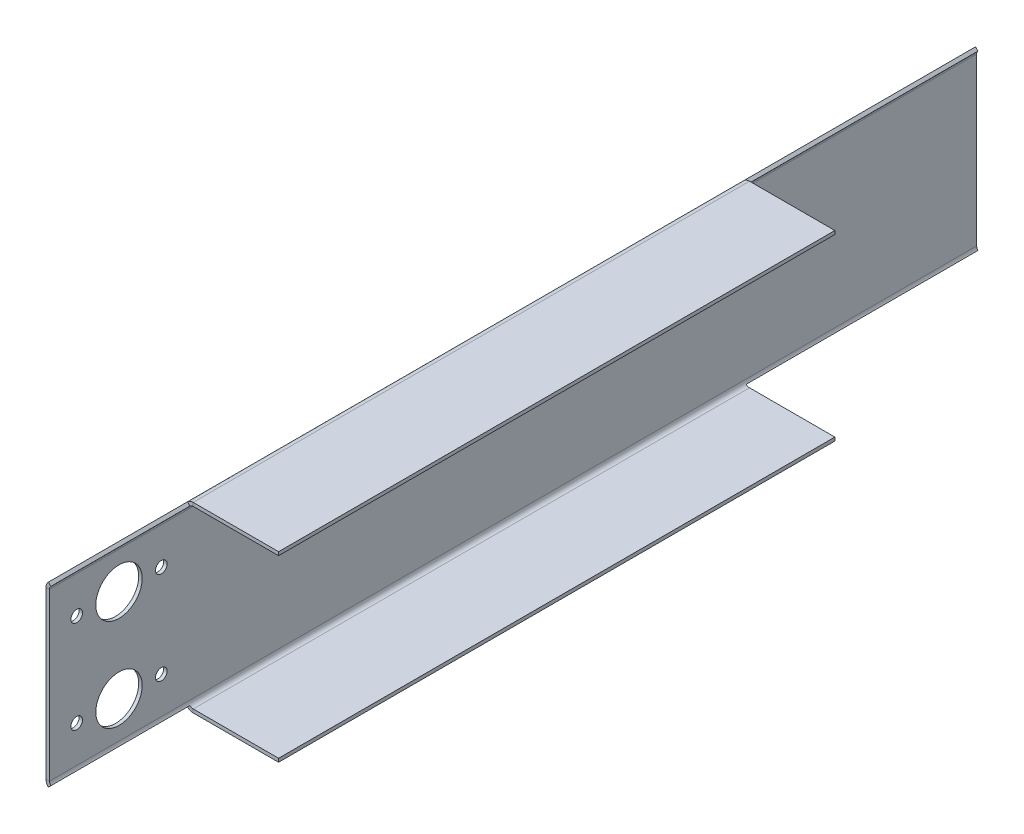
ISO-10303-21;
HEADER;
FILE_DESCRIPTION(('STEP AP214'),'2;1');
FILE_NAME('part.step','',(''),(''),'','','');
FILE_SCHEMA(('AUTOMOTIVE_DESIGN { 1 0 10303 214 1 1 1 1 }'));
ENDSEC;
DATA;
#1=APPLICATION_CONTEXT('core data for automotive mechanical design processes');
#2=APPLICATION_PROTOCOL_DEFINITION('international standard','automotive_design',2000,#1);
#3=PRODUCT_CONTEXT('',#1,'mechanical');
#4=PRODUCT('Part','Part','',(#3));
#5=PRODUCT_RELATED_PRODUCT_CATEGORY('part','',(#4));
#6=PRODUCT_DEFINITION_FORMATION('','',#4);
#7=PRODUCT_DEFINITION_CONTEXT('part definition',#1,'design');
#8=PRODUCT_DEFINITION('design','',#6,#7);
#9=PRODUCT_DEFINITION_SHAPE('','',#8);
#10=(LENGTH_UNIT() NAMED_UNIT(*) SI_UNIT(.MILLI.,.METRE.));
#11=(NAMED_UNIT(*) PLANE_ANGLE_UNIT() SI_UNIT($,.RADIAN.));
#12=(NAMED_UNIT(*) SI_UNIT($,.STERADIAN.) SOLID_ANGLE_UNIT());
#13=UNCERTAINTY_MEASURE_WITH_UNIT(LENGTH_MEASURE(1.E-05),#10,'distance_accuracy_value','');
#14=(GEOMETRIC_REPRESENTATION_CONTEXT(3) GLOBAL_UNCERTAINTY_ASSIGNED_CONTEXT((#13)) GLOBAL_UNIT_ASSIGNED_CONTEXT((#10,
#11,#12)) REPRESENTATION_CONTEXT('',''));
#15=CARTESIAN_POINT('',(0.,0.,0.));
#16=DIRECTION('',(0.,0.,1.));
#17=DIRECTION('',(1.,0.,0.));
#18=AXIS2_PLACEMENT_3D('',#15,#16,#17);
#19=CARTESIAN_POINT('',(0.,0.,-400.));
#20=DIRECTION('',(0.,0.,1.));
#21=DIRECTION('',(0.,1.,0.));
#22=AXIS2_PLACEMENT_3D('',#19,#20,#21);
#23=PLANE('',#22);
#24=DIRECTION('',(0.,1.,0.));
#25=VECTOR('',#24,1.);
#26=CARTESIAN_POINT('',(0.,0.,-400.));
#27=LINE('',#26,#25);
#28=CARTESIAN_POINT('',(0.,41.159844949343,-400.));
#29=VERTEX_POINT('',#28);
#30=CARTESIAN_POINT('',(0.,112.840155050657,-400.));
#31=VERTEX_POINT('',#30);
#32=EDGE_CURVE('E308',#29,#31,#27,.T.);
#33=ORIENTED_EDGE('',*,*,#32,.T.);
#34=DIRECTION('',(1.,0.,0.));
#35=VECTOR('',#34,1.);
#36=CARTESIAN_POINT('',(0.,112.840155050657,-400.));
#37=LINE('',#36,#35);
#38=CARTESIAN_POINT('',(1.5,112.840155050657,-400.));
#39=VERTEX_POINT('',#38);
#40=EDGE_CURVE('E12',#31,#39,#37,.T.);
#41=ORIENTED_EDGE('',*,*,#40,.T.);
#42=DIRECTION('',(0.,1.,0.));
#43=VECTOR('',#42,1.);
#44=CARTESIAN_POINT('',(1.5,0.,-400.));
#45=LINE('',#44,#43);
#46=CARTESIAN_POINT('',(1.5,41.159844949343,-400.));
#47=VERTEX_POINT('',#46);
#48=EDGE_CURVE('E312',#47,#39,#45,.T.);
#49=ORIENTED_EDGE('',*,*,#48,.F.);
#50=DIRECTION('',(-1.,0.,0.));
#51=VECTOR('',#50,1.);
#52=CARTESIAN_POINT('',(0.,41.159844949343,-400.));
#53=LINE('',#52,#51);
#54=EDGE_CURVE('E305',#47,#29,#53,.T.);
#55=ORIENTED_EDGE('',*,*,#54,.T.);
#56=EDGE_LOOP('',(#33,#41,#49,#55));
#57=FACE_BOUND('',#56,.T.);
#58=ADVANCED_FACE('F44',(#57),#23,.F.);
#59=CARTESIAN_POINT('',(0.,0.,0.));
#60=DIRECTION('',(0.,0.,-1.));
#61=DIRECTION('',(0.,-1.,0.));
#62=AXIS2_PLACEMENT_3D('',#59,#60,#61);
#63=PLANE('',#62);
#64=DIRECTION('',(0.,1.,0.));
#65=VECTOR('',#64,1.);
#66=CARTESIAN_POINT('',(1.5,0.,0.));
#67=LINE('',#66,#65);
#68=CARTESIAN_POINT('',(1.5,112.840155050657,0.));
#69=VERTEX_POINT('',#68);
#70=CARTESIAN_POINT('',(1.5,41.159844949343,0.));
#71=VERTEX_POINT('',#70);
#72=EDGE_CURVE('E48',#69,#71,#67,.F.);
#73=ORIENTED_EDGE('',*,*,#72,.F.);
#74=DIRECTION('',(-1.,0.,0.));
#75=VECTOR('',#74,1.);
#76=CARTESIAN_POINT('',(0.,112.840155050657,0.));
#77=LINE('',#76,#75);
#78=CARTESIAN_POINT('',(0.,112.840155050657,0.));
#79=VERTEX_POINT('',#78);
#80=EDGE_CURVE('E387',#69,#79,#77,.T.);
#81=ORIENTED_EDGE('',*,*,#80,.T.);
#82=DIRECTION('',(0.,-1.,0.));
#83=VECTOR('',#82,1.);
#84=CARTESIAN_POINT('',(0.,0.,0.));
#85=LINE('',#84,#83);
#86=CARTESIAN_POINT('',(0.,41.1598449493429,0.));
#87=VERTEX_POINT('',#86);
#88=EDGE_CURVE('E313',#79,#87,#85,.T.);
#89=ORIENTED_EDGE('',*,*,#88,.T.);
#90=DIRECTION('',(1.,0.,0.));
#91=VECTOR('',#90,1.);
#92=CARTESIAN_POINT('',(0.,41.1598449493429,0.));
#93=LINE('',#92,#91);
#94=EDGE_CURVE('E309',#87,#71,#93,.T.);
#95=ORIENTED_EDGE('',*,*,#94,.T.);
#96=EDGE_LOOP('',(#73,#81,#89,#95));
#97=FACE_BOUND('',#96,.T.);
#98=ADVANCED_FACE('F411',(#97),#63,.F.);
#99=CARTESIAN_POINT('',(0.,0.,0.));
#100=DIRECTION('',(-1.,0.,0.));
#101=DIRECTION('',(0.,0.,1.));
#102=AXIS2_PLACEMENT_3D('',#99,#100,#101);
#103=PLANE('',#102);
#104=CARTESIAN_POINT('',(0.,96.9999999999999,-11.75));
#105=DIRECTION('',(1.,0.,0.));
#106=DIRECTION('',(0.,0.,1.));
#107=AXIS2_PLACEMENT_3D('',#104,#105,#106);
#108=CIRCLE('',#107,2.5);
#109=CARTESIAN_POINT('',(0.,96.9999999999999,-9.24999999999999));
#110=VERTEX_POINT('',#109);
#111=EDGE_CURVE('E332',#110,#110,#108,.T.);
#112=ORIENTED_EDGE('',*,*,#111,.T.);
#113=EDGE_LOOP('',(#112));
#114=FACE_BOUND('',#113,.T.);
#115=CARTESIAN_POINT('',(0.,96.9999999999999,-48.25));
#116=DIRECTION('',(1.,0.,0.));
#117=DIRECTION('',(0.,0.,1.));
#118=AXIS2_PLACEMENT_3D('',#115,#116,#117);
#119=CIRCLE('',#118,2.5);
#120=CARTESIAN_POINT('',(0.,96.9999999999999,-45.75));
#121=VERTEX_POINT('',#120);
#122=EDGE_CURVE('E329',#121,#121,#119,.T.);
#123=ORIENTED_EDGE('',*,*,#122,.T.);
#124=EDGE_LOOP('',(#123));
#125=FACE_BOUND('',#124,.T.);
#126=CARTESIAN_POINT('',(0.,57.,-48.25));
#127=DIRECTION('',(1.,0.,0.));
#128=DIRECTION('',(0.,0.,-1.));
#129=AXIS2_PLACEMENT_3D('',#126,#127,#128);
#130=CIRCLE('',#129,2.5);
#131=CARTESIAN_POINT('',(0.,57.,-50.75));
#132=VERTEX_POINT('',#131);
#133=EDGE_CURVE('E326',#132,#132,#130,.T.);
#134=ORIENTED_EDGE('',*,*,#133,.T.);
#135=EDGE_LOOP('',(#134));
#136=FACE_BOUND('',#135,.T.);
#137=CARTESIAN_POINT('',(0.,57.,-11.75));
#138=DIRECTION('',(1.,0.,0.));
#139=DIRECTION('',(0.,0.,-1.));
#140=AXIS2_PLACEMENT_3D('',#137,#138,#139);
#141=CIRCLE('',#140,2.5);
#142=CARTESIAN_POINT('',(0.,57.,-14.25));
#143=VERTEX_POINT('',#142);
#144=EDGE_CURVE('E323',#143,#143,#141,.T.);
#145=ORIENTED_EDGE('',*,*,#144,.T.);
#146=EDGE_LOOP('',(#145));
#147=FACE_BOUND('',#146,.T.);
#148=CARTESIAN_POINT('',(0.,96.9999999999999,-30.));
#149=DIRECTION('',(1.,0.,0.));
#150=DIRECTION('',(0.,0.,1.));
#151=AXIS2_PLACEMENT_3D('',#148,#149,#150);
#152=CIRCLE('',#151,9.99999999999999);
#153=CARTESIAN_POINT('',(0.,96.9999999999999,-20.));
#154=VERTEX_POINT('',#153);
#155=EDGE_CURVE('E320',#154,#154,#152,.T.);
#156=ORIENTED_EDGE('',*,*,#155,.T.);
#157=EDGE_LOOP('',(#156));
#158=FACE_BOUND('',#157,.T.);
#159=CARTESIAN_POINT('',(0.,57.,-30.));
#160=DIRECTION('',(1.,0.,0.));
#161=DIRECTION('',(0.,0.,-1.));
#162=AXIS2_PLACEMENT_3D('',#159,#160,#161);
#163=CIRCLE('',#162,10.);
#164=CARTESIAN_POINT('',(0.,57.,-40.));
#165=VERTEX_POINT('',#164);
#166=EDGE_CURVE('E317',#165,#165,#163,.T.);
#167=ORIENTED_EDGE('',*,*,#166,.T.);
#168=EDGE_LOOP('',(#167));
#169=FACE_BOUND('',#168,.T.);
#170=ORIENTED_EDGE('',*,*,#88,.F.);
#171=DIRECTION('',(0.,0.,-1.));
#172=VECTOR('',#171,1.);
#173=CARTESIAN_POINT('',(0.,112.840155050657,0.));
#174=LINE('',#173,#172);
#175=EDGE_CURVE('E378',#79,#31,#174,.T.);
#176=ORIENTED_EDGE('',*,*,#175,.T.);
#177=ORIENTED_EDGE('',*,*,#32,.F.);
#178=DIRECTION('',(0.,0.,1.));
#179=VECTOR('',#178,1.);
#180=CARTESIAN_POINT('',(0.,41.1598449493429,0.));
#181=LINE('',#180,#179);
#182=EDGE_CURVE('E314',#29,#87,#181,.T.);
#183=ORIENTED_EDGE('',*,*,#182,.T.);
#184=EDGE_LOOP('',(#170,#176,#177,#183));
#185=FACE_BOUND('',#184,.T.);
#186=ADVANCED_FACE('F414',(#114,#125,#136,#147,#158,#169,#185),#103,.T.);
#187=CARTESIAN_POINT('',(40.340155050657,39.1598449493431,0.));
#188=DIRECTION('',(0.,-1.,0.));
#189=DIRECTION('',(0.,0.,1.));
#190=AXIS2_PLACEMENT_3D('',#187,#188,#189);
#191=PLANE('',#190);
#192=DIRECTION('',(-1.,0.,0.));
#193=VECTOR('',#192,1.);
#194=CARTESIAN_POINT('',(40.340155050657,39.1598449493431,-300.));
#195=LINE('',#194,#193);
#196=CARTESIAN_POINT('',(40.340155050657,39.1598449493431,-300.));
#197=VERTEX_POINT('',#196);
#198=CARTESIAN_POINT('',(3.50000000000003,39.159844949343,-300.));
#199=VERTEX_POINT('',#198);
#200=EDGE_CURVE('E69',#197,#199,#195,.T.);
#201=ORIENTED_EDGE('',*,*,#200,.T.);
#202=DIRECTION('',(0.,0.,1.));
#203=VECTOR('',#202,1.);
#204=CARTESIAN_POINT('',(3.50000000000002,39.1598449493429,0.));
#205=LINE('',#204,#203);
#206=CARTESIAN_POINT('',(3.5,39.159844949343,-60.));
#207=VERTEX_POINT('',#206);
#208=EDGE_CURVE('E373',#199,#207,#205,.T.);
#209=ORIENTED_EDGE('',*,*,#208,.T.);
#210=DIRECTION('',(-1.,0.,0.));
#211=VECTOR('',#210,1.);
#212=CARTESIAN_POINT('',(40.340155050657,39.1598449493431,-60.));
#213=LINE('',#212,#211);
#214=CARTESIAN_POINT('',(40.340155050657,39.1598449493431,-60.));
#215=VERTEX_POINT('',#214);
#216=EDGE_CURVE('E382',#207,#215,#213,.F.);
#217=ORIENTED_EDGE('',*,*,#216,.T.);
#218=DIRECTION('',(0.,0.,1.));
#219=VECTOR('',#218,1.);
#220=CARTESIAN_POINT('',(40.340155050657,39.1598449493431,0.));
#221=LINE('',#220,#219);
#222=EDGE_CURVE('E360',#215,#197,#221,.F.);
#223=ORIENTED_EDGE('',*,*,#222,.T.);
#224=EDGE_LOOP('',(#201,#209,#217,#223));
#225=FACE_BOUND('',#224,.T.);
#226=ADVANCED_FACE('F457',(#225),#191,.F.);
#227=CARTESIAN_POINT('',(40.340155050657,37.6598449493431,-300.));
#228=DIRECTION('',(0.,0.,1.));
#229=DIRECTION('',(-1.,0.,0.));
#230=AXIS2_PLACEMENT_3D('',#227,#228,#229);
#231=PLANE('',#230);
#232=DIRECTION('',(0.,-1.,0.));
#233=VECTOR('',#232,1.);
#234=CARTESIAN_POINT('',(3.50000000000002,37.659844949343,-300.));
#235=LINE('',#234,#233);
#236=CARTESIAN_POINT('',(3.50000000000004,37.659844949343,-300.));
#237=VERTEX_POINT('',#236);
#238=EDGE_CURVE('E375',#199,#237,#235,.T.);
#239=ORIENTED_EDGE('',*,*,#238,.F.);
#240=ORIENTED_EDGE('',*,*,#200,.F.);
#241=DIRECTION('',(0.,-1.,0.));
#242=VECTOR('',#241,1.);
#243=CARTESIAN_POINT('',(40.340155050657,37.6598449493431,-300.));
#244=LINE('',#243,#242);
#245=CARTESIAN_POINT('',(40.340155050657,37.6598449493431,-300.));
#246=VERTEX_POINT('',#245);
#247=EDGE_CURVE('E365',#197,#246,#244,.T.);
#248=ORIENTED_EDGE('',*,*,#247,.T.);
#249=DIRECTION('',(-1.,0.,0.));
#250=VECTOR('',#249,1.);
#251=CARTESIAN_POINT('',(40.340155050657,37.6598449493431,-300.));
#252=LINE('',#251,#250);
#253=EDGE_CURVE('E359',#246,#237,#252,.T.);
#254=ORIENTED_EDGE('',*,*,#253,.T.);
#255=EDGE_LOOP('',(#239,#240,#248,#254));
#256=FACE_BOUND('',#255,.T.);
#257=ADVANCED_FACE('F462',(#256),#231,.F.);
#258=CARTESIAN_POINT('',(40.340155050657,37.6598449493431,0.));
#259=DIRECTION('',(-1.,0.,0.));
#260=DIRECTION('',(0.,0.,-1.));
#261=AXIS2_PLACEMENT_3D('',#258,#259,#260);
#262=PLANE('',#261);
#263=ORIENTED_EDGE('',*,*,#247,.F.);
#264=ORIENTED_EDGE('',*,*,#222,.F.);
#265=DIRECTION('',(0.,-1.,0.));
#266=VECTOR('',#265,1.);
#267=CARTESIAN_POINT('',(40.340155050657,37.6598449493431,-60.));
#268=LINE('',#267,#266);
#269=CARTESIAN_POINT('',(40.340155050657,37.6598449493431,-60.));
#270=VERTEX_POINT('',#269);
#271=EDGE_CURVE('E358',#215,#270,#268,.T.);
#272=ORIENTED_EDGE('',*,*,#271,.T.);
#273=DIRECTION('',(0.,0.,-1.));
#274=VECTOR('',#273,1.);
#275=CARTESIAN_POINT('',(40.340155050657,37.6598449493431,0.));
#276=LINE('',#275,#274);
#277=EDGE_CURVE('E355',#270,#246,#276,.T.);
#278=ORIENTED_EDGE('',*,*,#277,.T.);
#279=EDGE_LOOP('',(#263,#264,#272,#278));
#280=FACE_BOUND('',#279,.T.);
#281=ADVANCED_FACE('F503',(#280),#262,.F.);
#282=CARTESIAN_POINT('',(40.340155050657,37.6598449493431,-60.));
#283=DIRECTION('',(0.,0.,-1.));
#284=DIRECTION('',(1.,0.,0.));
#285=AXIS2_PLACEMENT_3D('',#282,#283,#284);
#286=PLANE('',#285);
#287=DIRECTION('',(0.,1.,0.));
#288=VECTOR('',#287,1.);
#289=CARTESIAN_POINT('',(3.50000000000002,37.659844949343,-60.));
#290=LINE('',#289,#288);
#291=CARTESIAN_POINT('',(3.49999999999999,37.6598449493429,-59.9999999999999));
#292=VERTEX_POINT('',#291);
#293=EDGE_CURVE('E370',#292,#207,#290,.T.);
#294=ORIENTED_EDGE('',*,*,#293,.F.);
#295=DIRECTION('',(1.,0.,0.));
#296=VECTOR('',#295,1.);
#297=CARTESIAN_POINT('',(40.340155050657,37.6598449493431,-60.));
#298=LINE('',#297,#296);
#299=EDGE_CURVE('E362',#292,#270,#298,.T.);
#300=ORIENTED_EDGE('',*,*,#299,.T.);
#301=ORIENTED_EDGE('',*,*,#271,.F.);
#302=ORIENTED_EDGE('',*,*,#216,.F.);
#303=EDGE_LOOP('',(#294,#300,#301,#302));
#304=FACE_BOUND('',#303,.T.);
#305=ADVANCED_FACE('F506',(#304),#286,.F.);
#306=CARTESIAN_POINT('',(40.340155050657,37.6598449493431,0.));
#307=DIRECTION('',(0.,-1.,0.));
#308=DIRECTION('',(0.,0.,1.));
#309=AXIS2_PLACEMENT_3D('',#306,#307,#308);
#310=PLANE('',#309);
#311=DIRECTION('',(0.,0.,1.));
#312=VECTOR('',#311,1.);
#313=CARTESIAN_POINT('',(3.50000000000002,37.6598449493429,0.));
#314=LINE('',#313,#312);
#315=EDGE_CURVE('E367',#237,#292,#314,.T.);
#316=ORIENTED_EDGE('',*,*,#315,.F.);
#317=ORIENTED_EDGE('',*,*,#253,.F.);
#318=ORIENTED_EDGE('',*,*,#277,.F.);
#319=ORIENTED_EDGE('',*,*,#299,.F.);
#320=EDGE_LOOP('',(#316,#317,#318,#319));
#321=FACE_BOUND('',#320,.T.);
#322=ADVANCED_FACE('F480',(#321),#310,.T.);
#323=CARTESIAN_POINT('',(0.,57.,-30.));
#324=DIRECTION('',(1.,0.,0.));
#325=DIRECTION('',(0.,0.,-1.));
#326=AXIS2_PLACEMENT_3D('',#323,#324,#325);
#327=CYLINDRICAL_SURFACE('',#326,10.);
#328=ORIENTED_EDGE('',*,*,#166,.F.);
#329=EDGE_LOOP('',(#328));
#330=FACE_BOUND('',#329,.T.);
#331=CARTESIAN_POINT('',(1.5,57.,-30.));
#332=DIRECTION('',(1.,0.,0.));
#333=DIRECTION('',(0.,0.,-1.));
#334=AXIS2_PLACEMENT_3D('',#331,#332,#333);
#335=CIRCLE('',#334,10.);
#336=CARTESIAN_POINT('',(1.5,57.,-40.));
#337=VERTEX_POINT('',#336);
#338=EDGE_CURVE('E350',#337,#337,#335,.T.);
#339=ORIENTED_EDGE('',*,*,#338,.T.);
#340=EDGE_LOOP('',(#339));
#341=FACE_BOUND('',#340,.T.);
#342=ADVANCED_FACE('F476',(#330,#341),#327,.F.);
#343=CARTESIAN_POINT('',(0.,96.9999999999999,-30.));
#344=DIRECTION('',(1.,0.,0.));
#345=DIRECTION('',(0.,0.,-1.));
#346=AXIS2_PLACEMENT_3D('',#343,#344,#345);
#347=CYLINDRICAL_SURFACE('',#346,9.99999999999999);
#348=ORIENTED_EDGE('',*,*,#155,.F.);
#349=EDGE_LOOP('',(#348));
#350=FACE_BOUND('',#349,.T.);
#351=CARTESIAN_POINT('',(1.5,96.9999999999999,-30.));
#352=DIRECTION('',(1.,0.,0.));
#353=DIRECTION('',(0.,0.,-1.));
#354=AXIS2_PLACEMENT_3D('',#351,#352,#353);
#355=CIRCLE('',#354,9.99999999999999);
#356=CARTESIAN_POINT('',(1.5,96.9999999999999,-40.));
#357=VERTEX_POINT('',#356);
#358=EDGE_CURVE('E347',#357,#357,#355,.T.);
#359=ORIENTED_EDGE('',*,*,#358,.T.);
#360=EDGE_LOOP('',(#359));
#361=FACE_BOUND('',#360,.T.);
#362=ADVANCED_FACE('F479',(#350,#361),#347,.F.);
#363=CARTESIAN_POINT('',(0.,57.,-11.75));
#364=DIRECTION('',(1.,0.,0.));
#365=DIRECTION('',(0.,0.,-1.));
#366=AXIS2_PLACEMENT_3D('',#363,#364,#365);
#367=CYLINDRICAL_SURFACE('',#366,2.5);
#368=ORIENTED_EDGE('',*,*,#144,.F.);
#369=EDGE_LOOP('',(#368));
#370=FACE_BOUND('',#369,.T.);
#371=CARTESIAN_POINT('',(1.5,57.,-11.75));
#372=DIRECTION('',(1.,0.,0.));
#373=DIRECTION('',(0.,0.,-1.));
#374=AXIS2_PLACEMENT_3D('',#371,#372,#373);
#375=CIRCLE('',#374,2.5);
#376=CARTESIAN_POINT('',(1.5,57.,-14.25));
#377=VERTEX_POINT('',#376);
#378=EDGE_CURVE('E344',#377,#377,#375,.T.);
#379=ORIENTED_EDGE('',*,*,#378,.T.);
#380=EDGE_LOOP('',(#379));
#381=FACE_BOUND('',#380,.T.);
#382=ADVANCED_FACE('F543',(#370,#381),#367,.F.);
#383=CARTESIAN_POINT('',(0.,57.,-48.25));
#384=DIRECTION('',(1.,0.,0.));
#385=DIRECTION('',(0.,0.,-1.));
#386=AXIS2_PLACEMENT_3D('',#383,#384,#385);
#387=CYLINDRICAL_SURFACE('',#386,2.5);
#388=ORIENTED_EDGE('',*,*,#133,.F.);
#389=EDGE_LOOP('',(#388));
#390=FACE_BOUND('',#389,.T.);
#391=CARTESIAN_POINT('',(1.5,57.,-48.25));
#392=DIRECTION('',(1.,0.,0.));
#393=DIRECTION('',(0.,0.,-1.));
#394=AXIS2_PLACEMENT_3D('',#391,#392,#393);
#395=CIRCLE('',#394,2.5);
#396=CARTESIAN_POINT('',(1.5,57.,-50.75));
#397=VERTEX_POINT('',#396);
#398=EDGE_CURVE('E341',#397,#397,#395,.T.);
#399=ORIENTED_EDGE('',*,*,#398,.T.);
#400=EDGE_LOOP('',(#399));
#401=FACE_BOUND('',#400,.T.);
#402=ADVANCED_FACE('F497',(#390,#401),#387,.F.);
#403=CARTESIAN_POINT('',(0.,96.9999999999999,-48.25));
#404=DIRECTION('',(1.,0.,0.));
#405=DIRECTION('',(0.,0.,-1.));
#406=AXIS2_PLACEMENT_3D('',#403,#404,#405);
#407=CYLINDRICAL_SURFACE('',#406,2.5);
#408=ORIENTED_EDGE('',*,*,#122,.F.);
#409=EDGE_LOOP('',(#408));
#410=FACE_BOUND('',#409,.T.);
#411=CARTESIAN_POINT('',(1.5,96.9999999999999,-48.25));
#412=DIRECTION('',(1.,0.,0.));
#413=DIRECTION('',(0.,0.,-1.));
#414=AXIS2_PLACEMENT_3D('',#411,#412,#413);
#415=CIRCLE('',#414,2.5);
#416=CARTESIAN_POINT('',(1.5,96.9999999999999,-50.75));
#417=VERTEX_POINT('',#416);
#418=EDGE_CURVE('E338',#417,#417,#415,.T.);
#419=ORIENTED_EDGE('',*,*,#418,.T.);
#420=EDGE_LOOP('',(#419));
#421=FACE_BOUND('',#420,.T.);
#422=ADVANCED_FACE('F491',(#410,#421),#407,.F.);
#423=CARTESIAN_POINT('',(0.,96.9999999999999,-11.75));
#424=DIRECTION('',(1.,0.,0.));
#425=DIRECTION('',(0.,0.,-1.));
#426=AXIS2_PLACEMENT_3D('',#423,#424,#425);
#427=CYLINDRICAL_SURFACE('',#426,2.5);
#428=ORIENTED_EDGE('',*,*,#111,.F.);
#429=EDGE_LOOP('',(#428));
#430=FACE_BOUND('',#429,.T.);
#431=CARTESIAN_POINT('',(1.5,96.9999999999999,-11.75));
#432=DIRECTION('',(1.,0.,0.));
#433=DIRECTION('',(0.,0.,-1.));
#434=AXIS2_PLACEMENT_3D('',#431,#432,#433);
#435=CIRCLE('',#434,2.5);
#436=CARTESIAN_POINT('',(1.5,96.9999999999999,-14.25));
#437=VERTEX_POINT('',#436);
#438=EDGE_CURVE('E335',#437,#437,#435,.T.);
#439=ORIENTED_EDGE('',*,*,#438,.T.);
#440=EDGE_LOOP('',(#439));
#441=FACE_BOUND('',#440,.T.);
#442=ADVANCED_FACE('F485',(#430,#441),#427,.F.);
#443=CARTESIAN_POINT('',(1.5,0.,0.));
#444=DIRECTION('',(-1.,0.,0.));
#445=DIRECTION('',(0.,0.,1.));
#446=AXIS2_PLACEMENT_3D('',#443,#444,#445);
#447=PLANE('',#446);
#448=DIRECTION('',(0.,0.,-1.));
#449=VECTOR('',#448,1.);
#450=CARTESIAN_POINT('',(1.5,112.840155050657,0.));
#451=LINE('',#450,#449);
#452=EDGE_CURVE('E53',#69,#39,#451,.T.);
#453=ORIENTED_EDGE('',*,*,#452,.F.);
#454=ORIENTED_EDGE('',*,*,#72,.T.);
#455=DIRECTION('',(0.,0.,1.));
#456=VECTOR('',#455,1.);
#457=CARTESIAN_POINT('',(1.5,41.1598449493429,0.));
#458=LINE('',#457,#456);
#459=EDGE_CURVE('E303',#47,#71,#458,.T.);
#460=ORIENTED_EDGE('',*,*,#459,.F.);
#461=ORIENTED_EDGE('',*,*,#48,.T.);
#462=EDGE_LOOP('',(#453,#454,#460,#461));
#463=FACE_BOUND('',#462,.T.);
#464=ORIENTED_EDGE('',*,*,#438,.F.);
#465=EDGE_LOOP('',(#464));
#466=FACE_BOUND('',#465,.T.);
#467=ORIENTED_EDGE('',*,*,#418,.F.);
#468=EDGE_LOOP('',(#467));
#469=FACE_BOUND('',#468,.T.);
#470=ORIENTED_EDGE('',*,*,#398,.F.);
#471=EDGE_LOOP('',(#470));
#472=FACE_BOUND('',#471,.T.);
#473=ORIENTED_EDGE('',*,*,#378,.F.);
#474=EDGE_LOOP('',(#473));
#475=FACE_BOUND('',#474,.T.);
#476=ORIENTED_EDGE('',*,*,#358,.F.);
#477=EDGE_LOOP('',(#476));
#478=FACE_BOUND('',#477,.T.);
#479=ORIENTED_EDGE('',*,*,#338,.F.);
#480=EDGE_LOOP('',(#479));
#481=FACE_BOUND('',#480,.T.);
#482=ADVANCED_FACE('F46',(#463,#466,#469,#472,#475,#478,#481),#447,.F.);
#483=CARTESIAN_POINT('',(3.5,41.159844949343,-400.));
#484=DIRECTION('',(0.,0.,-1.));
#485=DIRECTION('',(-1.,0.,0.));
#486=AXIS2_PLACEMENT_3D('',#483,#484,#485);
#487=PLANE('',#486);
#488=ORIENTED_EDGE('',*,*,#54,.F.);
#489=CARTESIAN_POINT('',(3.5,41.159844949343,-400.));
#490=DIRECTION('',(0.,0.,1.));
#491=DIRECTION('',(0.,-1.,0.));
#492=AXIS2_PLACEMENT_3D('',#489,#490,#491);
#493=CIRCLE('',#492,2.);
#494=CARTESIAN_POINT('',(2.0857864376269,39.7456313869699,-400.));
#495=VERTEX_POINT('',#494);
#496=EDGE_CURVE('E259',#47,#495,#493,.T.);
#497=ORIENTED_EDGE('',*,*,#496,.T.);
#498=DIRECTION('',(-0.707106781186551,-0.707106781186544,0.));
#499=VECTOR('',#498,1.);
#500=CARTESIAN_POINT('',(1.02512626584707,38.6849712151901,-400.));
#501=LINE('',#500,#499);
#502=CARTESIAN_POINT('',(1.02512626584707,38.6849712151901,-400.));
#503=VERTEX_POINT('',#502);
#504=EDGE_CURVE('E301',#495,#503,#501,.T.);
#505=ORIENTED_EDGE('',*,*,#504,.T.);
#506=CARTESIAN_POINT('',(3.5,41.159844949343,-400.));
#507=DIRECTION('',(0.,0.,1.));
#508=DIRECTION('',(-1.,0.,0.));
#509=AXIS2_PLACEMENT_3D('',#506,#507,#508);
#510=CIRCLE('',#509,3.5);
#511=EDGE_CURVE('E261',#29,#503,#510,.T.);
#512=ORIENTED_EDGE('',*,*,#511,.F.);
#513=EDGE_LOOP('',(#488,#497,#505,#512));
#514=FACE_BOUND('',#513,.T.);
#515=ADVANCED_FACE('F421',(#514),#487,.T.);
#516=CARTESIAN_POINT('',(1.02512626584706,38.6849712151901,-350.));
#517=DIRECTION('',(0.707106781186542,-0.707106781186553,0.));
#518=DIRECTION('',(0.,0.,1.));
#519=AXIS2_PLACEMENT_3D('',#516,#517,#518);
#520=PLANE('',#519);
#521=ORIENTED_EDGE('',*,*,#504,.F.);
#522=DIRECTION('',(0.,0.,1.));
#523=VECTOR('',#522,1.);
#524=CARTESIAN_POINT('',(2.08578643762689,39.7456313869699,-600.026136297143));
#525=LINE('',#524,#523);
#526=CARTESIAN_POINT('',(2.08578643762689,39.7456313869699,-300.));
#527=VERTEX_POINT('',#526);
#528=EDGE_CURVE('E290',#495,#527,#525,.T.);
#529=ORIENTED_EDGE('',*,*,#528,.T.);
#530=DIRECTION('',(-0.707106781186555,-0.70710678118654,0.));
#531=VECTOR('',#530,1.);
#532=CARTESIAN_POINT('',(1.02512626584706,38.6849712151901,-300.));
#533=LINE('',#532,#531);
#534=CARTESIAN_POINT('',(1.02512626584706,38.6849712151901,-300.));
#535=VERTEX_POINT('',#534);
#536=EDGE_CURVE('E299',#527,#535,#533,.T.);
#537=ORIENTED_EDGE('',*,*,#536,.T.);
#538=DIRECTION('',(0.,0.,1.));
#539=VECTOR('',#538,1.);
#540=CARTESIAN_POINT('',(1.02512626584706,38.6849712151901,-300.));
#541=LINE('',#540,#539);
#542=EDGE_CURVE('E264',#503,#535,#541,.T.);
#543=ORIENTED_EDGE('',*,*,#542,.F.);
#544=EDGE_LOOP('',(#521,#529,#537,#543));
#545=FACE_BOUND('',#544,.T.);
#546=ADVANCED_FACE('F423',(#545),#520,.T.);
#547=CARTESIAN_POINT('',(3.5,41.159844949343,-300.));
#548=DIRECTION('',(0.,0.,-1.));
#549=DIRECTION('',(-1.,0.,0.));
#550=AXIS2_PLACEMENT_3D('',#547,#548,#549);
#551=PLANE('',#550);
#552=ORIENTED_EDGE('',*,*,#536,.F.);
#553=CARTESIAN_POINT('',(3.5,41.159844949343,-300.));
#554=DIRECTION('',(0.,0.,1.));
#555=DIRECTION('',(0.,-1.,0.));
#556=AXIS2_PLACEMENT_3D('',#553,#554,#555);
#557=CIRCLE('',#556,2.);
#558=EDGE_CURVE('E287',#527,#199,#557,.T.);
#559=ORIENTED_EDGE('',*,*,#558,.T.);
#560=ORIENTED_EDGE('',*,*,#238,.T.);
#561=CARTESIAN_POINT('',(3.5,41.159844949343,-300.));
#562=DIRECTION('',(0.,0.,1.));
#563=DIRECTION('',(-1.,0.,0.));
#564=AXIS2_PLACEMENT_3D('',#561,#562,#563);
#565=CIRCLE('',#564,3.5);
#566=EDGE_CURVE('E268',#535,#237,#565,.T.);
#567=ORIENTED_EDGE('',*,*,#566,.F.);
#568=EDGE_LOOP('',(#552,#559,#560,#567));
#569=FACE_BOUND('',#568,.T.);
#570=ADVANCED_FACE('F428',(#569),#551,.T.);
#571=CARTESIAN_POINT('',(3.5,41.159844949343,-59.9999999999999));
#572=DIRECTION('',(0.,0.,1.));
#573=DIRECTION('',(1.,0.,0.));
#574=AXIS2_PLACEMENT_3D('',#571,#572,#573);
#575=PLANE('',#574);
#576=ORIENTED_EDGE('',*,*,#293,.T.);
#577=CARTESIAN_POINT('',(3.5,41.159844949343,-59.9999999999999));
#578=DIRECTION('',(0.,0.,1.));
#579=DIRECTION('',(0.,-1.,0.));
#580=AXIS2_PLACEMENT_3D('',#577,#578,#579);
#581=CIRCLE('',#580,2.);
#582=CARTESIAN_POINT('',(2.08578643762687,39.7456313869699,-59.9999999999999));
#583=VERTEX_POINT('',#582);
#584=EDGE_CURVE('E284',#207,#583,#581,.F.);
#585=ORIENTED_EDGE('',*,*,#584,.T.);
#586=DIRECTION('',(-0.707106781186563,-0.707106781186533,0.));
#587=VECTOR('',#586,1.);
#588=CARTESIAN_POINT('',(1.02512626584703,38.6849712151901,-59.9999999999999));
#589=LINE('',#588,#587);
#590=CARTESIAN_POINT('',(1.02512626584703,38.6849712151901,-59.9999999999999));
#591=VERTEX_POINT('',#590);
#592=EDGE_CURVE('E297',#583,#591,#589,.T.);
#593=ORIENTED_EDGE('',*,*,#592,.T.);
#594=CARTESIAN_POINT('',(3.5,41.159844949343,-59.9999999999999));
#595=DIRECTION('',(0.,0.,-1.));
#596=DIRECTION('',(1.,0.,0.));
#597=AXIS2_PLACEMENT_3D('',#594,#595,#596);
#598=CIRCLE('',#597,3.5);
#599=EDGE_CURVE('E271',#292,#591,#598,.T.);
#600=ORIENTED_EDGE('',*,*,#599,.F.);
#601=EDGE_LOOP('',(#576,#585,#593,#600));
#602=FACE_BOUND('',#601,.T.);
#603=ADVANCED_FACE('F436',(#602),#575,.T.);
#604=CARTESIAN_POINT('',(1.02512626584703,38.6849712151901,-30.));
#605=DIRECTION('',(0.707106781186533,-0.707106781186562,0.));
#606=DIRECTION('',(0.,0.,1.));
#607=AXIS2_PLACEMENT_3D('',#604,#605,#606);
#608=PLANE('',#607);
#609=ORIENTED_EDGE('',*,*,#592,.F.);
#610=DIRECTION('',(0.,0.,1.));
#611=VECTOR('',#610,1.);
#612=CARTESIAN_POINT('',(2.08578643762688,39.7456313869699,-600.026136297143));
#613=LINE('',#612,#611);
#614=CARTESIAN_POINT('',(2.08578643762688,39.7456313869699,0.));
#615=VERTEX_POINT('',#614);
#616=EDGE_CURVE('E281',#583,#615,#613,.T.);
#617=ORIENTED_EDGE('',*,*,#616,.T.);
#618=DIRECTION('',(-0.707106781186562,-0.707106781186533,0.));
#619=VECTOR('',#618,1.);
#620=CARTESIAN_POINT('',(1.02512626584703,38.6849712151901,0.));
#621=LINE('',#620,#619);
#622=CARTESIAN_POINT('',(1.02512626584703,38.6849712151901,0.));
#623=VERTEX_POINT('',#622);
#624=EDGE_CURVE('E280',#615,#623,#621,.T.);
#625=ORIENTED_EDGE('',*,*,#624,.T.);
#626=DIRECTION('',(0.,0.,1.));
#627=VECTOR('',#626,1.);
#628=CARTESIAN_POINT('',(1.02512626584703,38.6849712151901,0.));
#629=LINE('',#628,#627);
#630=EDGE_CURVE('E274',#591,#623,#629,.T.);
#631=ORIENTED_EDGE('',*,*,#630,.F.);
#632=EDGE_LOOP('',(#609,#617,#625,#631));
#633=FACE_BOUND('',#632,.T.);
#634=ADVANCED_FACE('F438',(#633),#608,.T.);
#635=CARTESIAN_POINT('',(3.5,41.1598449493429,0.));
#636=DIRECTION('',(0.,0.,1.));
#637=DIRECTION('',(0.,-1.,0.));
#638=AXIS2_PLACEMENT_3D('',#635,#636,#637);
#639=PLANE('',#638);
#640=CARTESIAN_POINT('',(3.5,41.1598449493429,0.));
#641=DIRECTION('',(0.,0.,1.));
#642=DIRECTION('',(0.,-1.,0.));
#643=AXIS2_PLACEMENT_3D('',#640,#641,#642);
#644=CIRCLE('',#643,2.);
#645=EDGE_CURVE('E265',#615,#71,#644,.F.);
#646=ORIENTED_EDGE('',*,*,#645,.T.);
#647=ORIENTED_EDGE('',*,*,#94,.F.);
#648=CARTESIAN_POINT('',(3.5,41.1598449493429,0.));
#649=DIRECTION('',(0.,0.,-1.));
#650=DIRECTION('',(0.,-1.,0.));
#651=AXIS2_PLACEMENT_3D('',#648,#649,#650);
#652=CIRCLE('',#651,3.5);
#653=EDGE_CURVE('E277',#623,#87,#652,.T.);
#654=ORIENTED_EDGE('',*,*,#653,.F.);
#655=ORIENTED_EDGE('',*,*,#624,.F.);
#656=EDGE_LOOP('',(#646,#647,#654,#655));
#657=FACE_BOUND('',#656,.T.);
#658=ADVANCED_FACE('F404',(#657),#639,.T.);
#659=CARTESIAN_POINT('',(3.5,41.159844949343,-600.026136297143));
#660=DIRECTION('',(0.,0.,1.));
#661=DIRECTION('',(0.,-1.,0.));
#662=AXIS2_PLACEMENT_3D('',#659,#660,#661);
#663=CYLINDRICAL_SURFACE('',#662,3.5);
#664=ORIENTED_EDGE('',*,*,#630,.T.);
#665=ORIENTED_EDGE('',*,*,#653,.T.);
#666=ORIENTED_EDGE('',*,*,#182,.F.);
#667=ORIENTED_EDGE('',*,*,#511,.T.);
#668=ORIENTED_EDGE('',*,*,#542,.T.);
#669=ORIENTED_EDGE('',*,*,#566,.T.);
#670=ORIENTED_EDGE('',*,*,#315,.T.);
#671=ORIENTED_EDGE('',*,*,#599,.T.);
#672=EDGE_LOOP('',(#664,#665,#666,#667,#668,#669,#670,#671));
#673=FACE_BOUND('',#672,.T.);
#674=ADVANCED_FACE('F418',(#673),#663,.T.);
#675=CARTESIAN_POINT('',(3.5,41.159844949343,-600.026136297143));
#676=DIRECTION('',(0.,0.,1.));
#677=DIRECTION('',(0.,-1.,0.));
#678=AXIS2_PLACEMENT_3D('',#675,#676,#677);
#679=CYLINDRICAL_SURFACE('',#678,2.);
#680=ORIENTED_EDGE('',*,*,#616,.F.);
#681=ORIENTED_EDGE('',*,*,#584,.F.);
#682=ORIENTED_EDGE('',*,*,#208,.F.);
#683=ORIENTED_EDGE('',*,*,#558,.F.);
#684=ORIENTED_EDGE('',*,*,#528,.F.);
#685=ORIENTED_EDGE('',*,*,#496,.F.);
#686=ORIENTED_EDGE('',*,*,#459,.T.);
#687=ORIENTED_EDGE('',*,*,#645,.F.);
#688=EDGE_LOOP('',(#680,#681,#682,#683,#684,#685,#686,#687));
#689=FACE_BOUND('',#688,.T.);
#690=ADVANCED_FACE('F409',(#689),#679,.F.);
#691=CARTESIAN_POINT('',(3.5,112.840155050657,0.));
#692=DIRECTION('',(0.,0.,1.));
#693=DIRECTION('',(1.,0.,0.));
#694=AXIS2_PLACEMENT_3D('',#691,#692,#693);
#695=PLANE('',#694);
#696=ORIENTED_EDGE('',*,*,#80,.F.);
#697=CARTESIAN_POINT('',(3.5,112.840155050657,0.));
#698=DIRECTION('',(0.,0.,-1.));
#699=DIRECTION('',(-1.,0.,0.));
#700=AXIS2_PLACEMENT_3D('',#697,#698,#699);
#701=CIRCLE('',#700,2.);
#702=CARTESIAN_POINT('',(2.08578643762691,114.25436861303,0.));
#703=VERTEX_POINT('',#702);
#704=EDGE_CURVE('E195',#69,#703,#701,.T.);
#705=ORIENTED_EDGE('',*,*,#704,.T.);
#706=DIRECTION('',(-0.707106781186546,0.707106781186549,0.));
#707=VECTOR('',#706,1.);
#708=CARTESIAN_POINT('',(1.02512626584709,115.31502878481,0.));
#709=LINE('',#708,#707);
#710=CARTESIAN_POINT('',(1.02512626584709,115.31502878481,0.));
#711=VERTEX_POINT('',#710);
#712=EDGE_CURVE('E257',#703,#711,#709,.T.);
#713=ORIENTED_EDGE('',*,*,#712,.T.);
#714=CARTESIAN_POINT('',(3.5,112.840155050657,0.));
#715=DIRECTION('',(0.,0.,-1.));
#716=DIRECTION('',(1.,0.,0.));
#717=AXIS2_PLACEMENT_3D('',#714,#715,#716);
#718=CIRCLE('',#717,3.5);
#719=EDGE_CURVE('E219',#79,#711,#718,.T.);
#720=ORIENTED_EDGE('',*,*,#719,.F.);
#721=EDGE_LOOP('',(#696,#705,#713,#720));
#722=FACE_BOUND('',#721,.T.);
#723=ADVANCED_FACE('F630',(#722),#695,.T.);
#724=CARTESIAN_POINT('',(1.02512626584708,115.31502878481,-30.));
#725=DIRECTION('',(0.707106781186548,0.707106781186547,0.));
#726=DIRECTION('',(0.,0.,-1.));
#727=AXIS2_PLACEMENT_3D('',#724,#725,#726);
#728=PLANE('',#727);
#729=ORIENTED_EDGE('',*,*,#712,.F.);
#730=DIRECTION('',(0.,0.,-1.));
#731=VECTOR('',#730,1.);
#732=CARTESIAN_POINT('',(2.08578643762691,114.25436861303,200.026136297143));
#733=LINE('',#732,#731);
#734=CARTESIAN_POINT('',(2.0857864376269,114.25436861303,-60.));
#735=VERTEX_POINT('',#734);
#736=EDGE_CURVE('E247',#703,#735,#733,.T.);
#737=ORIENTED_EDGE('',*,*,#736,.T.);
#738=DIRECTION('',(-0.70710678118655,0.707106781186545,0.));
#739=VECTOR('',#738,1.);
#740=CARTESIAN_POINT('',(1.02512626584708,115.31502878481,-60.));
#741=LINE('',#740,#739);
#742=CARTESIAN_POINT('',(1.02512626584708,115.31502878481,-60.));
#743=VERTEX_POINT('',#742);
#744=EDGE_CURVE('E255',#735,#743,#741,.T.);
#745=ORIENTED_EDGE('',*,*,#744,.T.);
#746=DIRECTION('',(0.,0.,-1.));
#747=VECTOR('',#746,1.);
#748=CARTESIAN_POINT('',(1.02512626584708,115.31502878481,-60.));
#749=LINE('',#748,#747);
#750=EDGE_CURVE('E222',#711,#743,#749,.T.);
#751=ORIENTED_EDGE('',*,*,#750,.F.);
#752=EDGE_LOOP('',(#729,#737,#745,#751));
#753=FACE_BOUND('',#752,.T.);
#754=ADVANCED_FACE('F664',(#753),#728,.T.);
#755=CARTESIAN_POINT('',(3.5,112.840155050657,-60.));
#756=DIRECTION('',(0.,0.,1.));
#757=DIRECTION('',(1.,0.,0.));
#758=AXIS2_PLACEMENT_3D('',#755,#756,#757);
#759=PLANE('',#758);
#760=ORIENTED_EDGE('',*,*,#744,.F.);
#761=CARTESIAN_POINT('',(3.5,112.840155050657,-60.));
#762=DIRECTION('',(0.,0.,-1.));
#763=DIRECTION('',(-1.,0.,0.));
#764=AXIS2_PLACEMENT_3D('',#761,#762,#763);
#765=CIRCLE('',#764,2.);
#766=CARTESIAN_POINT('',(3.50000000000002,114.840155050657,-60.));
#767=VERTEX_POINT('',#766);
#768=EDGE_CURVE('E244',#735,#767,#765,.T.);
#769=ORIENTED_EDGE('',*,*,#768,.T.);
#770=DIRECTION('',(0.,1.,0.));
#771=VECTOR('',#770,1.);
#772=CARTESIAN_POINT('',(3.50000000000002,116.340155050657,-60.));
#773=LINE('',#772,#771);
#774=CARTESIAN_POINT('',(3.50000000000002,116.340155050657,-60.));
#775=VERTEX_POINT('',#774);
#776=EDGE_CURVE('E203',#767,#775,#773,.T.);
#777=ORIENTED_EDGE('',*,*,#776,.T.);
#778=CARTESIAN_POINT('',(3.5,112.840155050657,-60.));
#779=DIRECTION('',(0.,0.,-1.));
#780=DIRECTION('',(1.,0.,0.));
#781=AXIS2_PLACEMENT_3D('',#778,#779,#780);
#782=CIRCLE('',#781,3.5);
#783=EDGE_CURVE('E225',#743,#775,#782,.T.);
#784=ORIENTED_EDGE('',*,*,#783,.F.);
#785=EDGE_LOOP('',(#760,#769,#777,#784));
#786=FACE_BOUND('',#785,.T.);
#787=ADVANCED_FACE('F676',(#786),#759,.T.);
#788=CARTESIAN_POINT('',(3.5,112.840155050657,-300.));
#789=DIRECTION('',(0.,0.,-1.));
#790=DIRECTION('',(-1.,0.,0.));
#791=AXIS2_PLACEMENT_3D('',#788,#789,#790);
#792=PLANE('',#791);
#793=DIRECTION('',(0.,-1.,0.));
#794=VECTOR('',#793,1.);
#795=CARTESIAN_POINT('',(3.50000000000002,116.340155050657,-300.));
#796=LINE('',#795,#794);
#797=CARTESIAN_POINT('',(3.50000000000001,116.340155050657,-300.));
#798=VERTEX_POINT('',#797);
#799=CARTESIAN_POINT('',(3.50000000000002,114.840155050657,-300.));
#800=VERTEX_POINT('',#799);
#801=EDGE_CURVE('E191',#798,#800,#796,.T.);
#802=ORIENTED_EDGE('',*,*,#801,.T.);
#803=CARTESIAN_POINT('',(3.5,112.840155050657,-300.));
#804=DIRECTION('',(0.,0.,-1.));
#805=DIRECTION('',(-1.,0.,0.));
#806=AXIS2_PLACEMENT_3D('',#803,#804,#805);
#807=CIRCLE('',#806,2.);
#808=CARTESIAN_POINT('',(2.0857864376269,114.25436861303,-300.));
#809=VERTEX_POINT('',#808);
#810=EDGE_CURVE('E241',#800,#809,#807,.F.);
#811=ORIENTED_EDGE('',*,*,#810,.T.);
#812=DIRECTION('',(-0.70710678118655,0.707106781186545,0.));
#813=VECTOR('',#812,1.);
#814=CARTESIAN_POINT('',(1.02512626584707,115.31502878481,-300.));
#815=LINE('',#814,#813);
#816=CARTESIAN_POINT('',(1.02512626584707,115.31502878481,-300.));
#817=VERTEX_POINT('',#816);
#818=EDGE_CURVE('E253',#809,#817,#815,.T.);
#819=ORIENTED_EDGE('',*,*,#818,.T.);
#820=CARTESIAN_POINT('',(3.5,112.840155050657,-300.));
#821=DIRECTION('',(0.,0.,1.));
#822=DIRECTION('',(-1.,0.,0.));
#823=AXIS2_PLACEMENT_3D('',#820,#821,#822);
#824=CIRCLE('',#823,3.5);
#825=EDGE_CURVE('E228',#798,#817,#824,.T.);
#826=ORIENTED_EDGE('',*,*,#825,.F.);
#827=EDGE_LOOP('',(#802,#811,#819,#826));
#828=FACE_BOUND('',#827,.T.);
#829=ADVANCED_FACE('F687',(#828),#792,.T.);
#830=CARTESIAN_POINT('',(1.02512626584708,115.31502878481,-350.));
#831=DIRECTION('',(0.707106781186545,0.70710678118655,0.));
#832=DIRECTION('',(0.,0.,-1.));
#833=AXIS2_PLACEMENT_3D('',#830,#831,#832);
#834=PLANE('',#833);
#835=ORIENTED_EDGE('',*,*,#818,.F.);
#836=DIRECTION('',(0.,0.,-1.));
#837=VECTOR('',#836,1.);
#838=CARTESIAN_POINT('',(2.0857864376269,114.25436861303,200.026136297143));
#839=LINE('',#838,#837);
#840=CARTESIAN_POINT('',(2.0857864376269,114.25436861303,-400.));
#841=VERTEX_POINT('',#840);
#842=EDGE_CURVE('E238',#809,#841,#839,.T.);
#843=ORIENTED_EDGE('',*,*,#842,.T.);
#844=DIRECTION('',(-0.70710678118655,0.707106781186545,0.));
#845=VECTOR('',#844,1.);
#846=CARTESIAN_POINT('',(1.02512626584708,115.31502878481,-400.));
#847=LINE('',#846,#845);
#848=CARTESIAN_POINT('',(1.02512626584708,115.31502878481,-400.));
#849=VERTEX_POINT('',#848);
#850=EDGE_CURVE('E237',#841,#849,#847,.T.);
#851=ORIENTED_EDGE('',*,*,#850,.T.);
#852=DIRECTION('',(0.,0.,-1.));
#853=VECTOR('',#852,1.);
#854=CARTESIAN_POINT('',(1.02512626584708,115.31502878481,-400.));
#855=LINE('',#854,#853);
#856=EDGE_CURVE('E231',#817,#849,#855,.T.);
#857=ORIENTED_EDGE('',*,*,#856,.F.);
#858=EDGE_LOOP('',(#835,#843,#851,#857));
#859=FACE_BOUND('',#858,.T.);
#860=ADVANCED_FACE('F698',(#859),#834,.T.);
#861=CARTESIAN_POINT('',(3.5,112.840155050657,-400.));
#862=DIRECTION('',(0.,0.,-1.));
#863=DIRECTION('',(-1.,0.,0.));
#864=AXIS2_PLACEMENT_3D('',#861,#862,#863);
#865=PLANE('',#864);
#866=CARTESIAN_POINT('',(3.5,112.840155050657,-400.));
#867=DIRECTION('',(0.,0.,-1.));
#868=DIRECTION('',(-1.,0.,0.));
#869=AXIS2_PLACEMENT_3D('',#866,#867,#868);
#870=CIRCLE('',#869,2.);
#871=EDGE_CURVE('E61',#841,#39,#870,.F.);
#872=ORIENTED_EDGE('',*,*,#871,.T.);
#873=ORIENTED_EDGE('',*,*,#40,.F.);
#874=CARTESIAN_POINT('',(3.5,112.840155050657,-400.));
#875=DIRECTION('',(0.,0.,1.));
#876=DIRECTION('',(-1.,0.,0.));
#877=AXIS2_PLACEMENT_3D('',#874,#875,#876);
#878=CIRCLE('',#877,3.5);
#879=EDGE_CURVE('E234',#849,#31,#878,.T.);
#880=ORIENTED_EDGE('',*,*,#879,.F.);
#881=ORIENTED_EDGE('',*,*,#850,.F.);
#882=EDGE_LOOP('',(#872,#873,#880,#881));
#883=FACE_BOUND('',#882,.T.);
#884=ADVANCED_FACE('F709',(#883),#865,.T.);
#885=CARTESIAN_POINT('',(3.5,112.840155050657,200.026136297143));
#886=DIRECTION('',(0.,0.,-1.));
#887=DIRECTION('',(-1.,0.,0.));
#888=AXIS2_PLACEMENT_3D('',#885,#886,#887);
#889=CYLINDRICAL_SURFACE('',#888,3.5);
#890=ORIENTED_EDGE('',*,*,#856,.T.);
#891=ORIENTED_EDGE('',*,*,#879,.T.);
#892=ORIENTED_EDGE('',*,*,#175,.F.);
#893=ORIENTED_EDGE('',*,*,#719,.T.);
#894=ORIENTED_EDGE('',*,*,#750,.T.);
#895=ORIENTED_EDGE('',*,*,#783,.T.);
#896=DIRECTION('',(0.,0.,-1.));
#897=VECTOR('',#896,1.);
#898=CARTESIAN_POINT('',(3.50000000000002,116.340155050657,0.));
#899=LINE('',#898,#897);
#900=EDGE_CURVE('E217',#775,#798,#899,.T.);
#901=ORIENTED_EDGE('',*,*,#900,.T.);
#902=ORIENTED_EDGE('',*,*,#825,.T.);
#903=EDGE_LOOP('',(#890,#891,#892,#893,#894,#895,#901,#902));
#904=FACE_BOUND('',#903,.T.);
#905=ADVANCED_FACE('F720',(#904),#889,.T.);
#906=CARTESIAN_POINT('',(3.5,112.840155050657,200.026136297143));
#907=DIRECTION('',(0.,0.,-1.));
#908=DIRECTION('',(-1.,0.,0.));
#909=AXIS2_PLACEMENT_3D('',#906,#907,#908);
#910=CYLINDRICAL_SURFACE('',#909,2.);
#911=ORIENTED_EDGE('',*,*,#842,.F.);
#912=ORIENTED_EDGE('',*,*,#810,.F.);
#913=DIRECTION('',(0.,0.,-1.));
#914=VECTOR('',#913,1.);
#915=CARTESIAN_POINT('',(3.50000000000002,114.840155050657,0.));
#916=LINE('',#915,#914);
#917=EDGE_CURVE('E903',#767,#800,#916,.T.);
#918=ORIENTED_EDGE('',*,*,#917,.F.);
#919=ORIENTED_EDGE('',*,*,#768,.F.);
#920=ORIENTED_EDGE('',*,*,#736,.F.);
#921=ORIENTED_EDGE('',*,*,#704,.F.);
#922=ORIENTED_EDGE('',*,*,#452,.T.);
#923=ORIENTED_EDGE('',*,*,#871,.F.);
#924=EDGE_LOOP('',(#911,#912,#918,#919,#920,#921,#922,#923));
#925=FACE_BOUND('',#924,.T.);
#926=ADVANCED_FACE('F730',(#925),#910,.F.);
#927=CARTESIAN_POINT('',(40.340155050657,116.340155050657,0.));
#928=DIRECTION('',(-1.,0.,0.));
#929=DIRECTION('',(0.,0.,1.));
#930=AXIS2_PLACEMENT_3D('',#927,#928,#929);
#931=PLANE('',#930);
#932=DIRECTION('',(0.,1.,0.));
#933=VECTOR('',#932,1.);
#934=CARTESIAN_POINT('',(40.340155050657,116.340155050657,-60.));
#935=LINE('',#934,#933);
#936=CARTESIAN_POINT('',(40.340155050657,114.840155050657,-60.));
#937=VERTEX_POINT('',#936);
#938=CARTESIAN_POINT('',(40.340155050657,116.340155050657,-60.));
#939=VERTEX_POINT('',#938);
#940=EDGE_CURVE('E209',#937,#939,#935,.T.);
#941=ORIENTED_EDGE('',*,*,#940,.F.);
#942=DIRECTION('',(0.,0.,1.));
#943=VECTOR('',#942,1.);
#944=CARTESIAN_POINT('',(40.340155050657,114.840155050657,0.));
#945=LINE('',#944,#943);
#946=CARTESIAN_POINT('',(40.340155050657,114.840155050657,-300.));
#947=VERTEX_POINT('',#946);
#948=EDGE_CURVE('E196',#947,#937,#945,.T.);
#949=ORIENTED_EDGE('',*,*,#948,.F.);
#950=DIRECTION('',(0.,1.,0.));
#951=VECTOR('',#950,1.);
#952=CARTESIAN_POINT('',(40.340155050657,116.340155050657,-300.));
#953=LINE('',#952,#951);
#954=CARTESIAN_POINT('',(40.340155050657,116.340155050657,-300.));
#955=VERTEX_POINT('',#954);
#956=EDGE_CURVE('E188',#947,#955,#953,.T.);
#957=ORIENTED_EDGE('',*,*,#956,.T.);
#958=DIRECTION('',(0.,0.,1.));
#959=VECTOR('',#958,1.);
#960=CARTESIAN_POINT('',(40.340155050657,116.340155050657,0.));
#961=LINE('',#960,#959);
#962=EDGE_CURVE('E201',#955,#939,#961,.T.);
#963=ORIENTED_EDGE('',*,*,#962,.T.);
#964=EDGE_LOOP('',(#941,#949,#957,#963));
#965=FACE_BOUND('',#964,.T.);
#966=ADVANCED_FACE('F200',(#965),#931,.F.);
#967=CARTESIAN_POINT('',(-113.659844949343,116.340155050657,0.));
#968=DIRECTION('',(0.,1.,0.));
#969=DIRECTION('',(0.,0.,1.));
#970=AXIS2_PLACEMENT_3D('',#967,#968,#969);
#971=PLANE('',#970);
#972=ORIENTED_EDGE('',*,*,#900,.F.);
#973=DIRECTION('',(-1.,0.,0.));
#974=VECTOR('',#973,1.);
#975=CARTESIAN_POINT('',(40.340155050657,116.340155050657,-60.));
#976=LINE('',#975,#974);
#977=EDGE_CURVE('E208',#939,#775,#976,.T.);
#978=ORIENTED_EDGE('',*,*,#977,.F.);
#979=ORIENTED_EDGE('',*,*,#962,.F.);
#980=DIRECTION('',(1.,0.,0.));
#981=VECTOR('',#980,1.);
#982=CARTESIAN_POINT('',(40.340155050657,116.340155050657,-300.));
#983=LINE('',#982,#981);
#984=EDGE_CURVE('E185',#798,#955,#983,.T.);
#985=ORIENTED_EDGE('',*,*,#984,.F.);
#986=EDGE_LOOP('',(#972,#978,#979,#985));
#987=FACE_BOUND('',#986,.T.);
#988=ADVANCED_FACE('F206',(#987),#971,.T.);
#989=CARTESIAN_POINT('',(40.340155050657,116.340155050657,-60.));
#990=DIRECTION('',(0.,0.,-1.));
#991=DIRECTION('',(-1.,0.,0.));
#992=AXIS2_PLACEMENT_3D('',#989,#990,#991);
#993=PLANE('',#992);
#994=ORIENTED_EDGE('',*,*,#776,.F.);
#995=DIRECTION('',(1.,0.,0.));
#996=VECTOR('',#995,1.);
#997=CARTESIAN_POINT('',(-113.659844949343,114.840155050657,-60.));
#998=LINE('',#997,#996);
#999=EDGE_CURVE('E900',#937,#767,#998,.F.);
#1000=ORIENTED_EDGE('',*,*,#999,.F.);
#1001=ORIENTED_EDGE('',*,*,#940,.T.);
#1002=ORIENTED_EDGE('',*,*,#977,.T.);
#1003=EDGE_LOOP('',(#994,#1000,#1001,#1002));
#1004=FACE_BOUND('',#1003,.T.);
#1005=ADVANCED_FACE('F759',(#1004),#993,.F.);
#1006=CARTESIAN_POINT('',(-113.659844949343,114.840155050657,0.));
#1007=DIRECTION('',(0.,1.,0.));
#1008=DIRECTION('',(0.,0.,1.));
#1009=AXIS2_PLACEMENT_3D('',#1006,#1007,#1008);
#1010=PLANE('',#1009);
#1011=ORIENTED_EDGE('',*,*,#999,.T.);
#1012=ORIENTED_EDGE('',*,*,#917,.T.);
#1013=DIRECTION('',(1.,0.,0.));
#1014=VECTOR('',#1013,1.);
#1015=CARTESIAN_POINT('',(-113.659844949343,114.840155050657,-300.));
#1016=LINE('',#1015,#1014);
#1017=EDGE_CURVE('E910',#800,#947,#1016,.T.);
#1018=ORIENTED_EDGE('',*,*,#1017,.T.);
#1019=ORIENTED_EDGE('',*,*,#948,.T.);
#1020=EDGE_LOOP('',(#1011,#1012,#1018,#1019));
#1021=FACE_BOUND('',#1020,.T.);
#1022=ADVANCED_FACE('F770',(#1021),#1010,.F.);
#1023=CARTESIAN_POINT('',(40.340155050657,116.340155050657,-300.));
#1024=DIRECTION('',(0.,0.,1.));
#1025=DIRECTION('',(1.,0.,0.));
#1026=AXIS2_PLACEMENT_3D('',#1023,#1024,#1025);
#1027=PLANE('',#1026);
#1028=ORIENTED_EDGE('',*,*,#801,.F.);
#1029=ORIENTED_EDGE('',*,*,#984,.T.);
#1030=ORIENTED_EDGE('',*,*,#956,.F.);
#1031=ORIENTED_EDGE('',*,*,#1017,.F.);
#1032=EDGE_LOOP('',(#1028,#1029,#1030,#1031));
#1033=FACE_BOUND('',#1032,.T.);
#1034=ADVANCED_FACE('F187',(#1033),#1027,.F.);
#1035=CLOSED_SHELL('',(#58,#98,#186,#226,#257,#281,#305,#322,#342,#362,#382,#402,#422,#442,#482,
#515,#546,#570,#603,#634,#658,#674,#690,#723,#754,#787,#829,#860,#884,#905,#926,#966,#988,#1005,
#1022,#1034));
#1036=MANIFOLD_SOLID_BREP('B2',#1035);
#1037=ADVANCED_BREP_SHAPE_REPRESENTATION('',(#18,#1036),#14);
#1038=SHAPE_DEFINITION_REPRESENTATION(#9,#1037);
ENDSEC;
END-ISO-10303-21;
